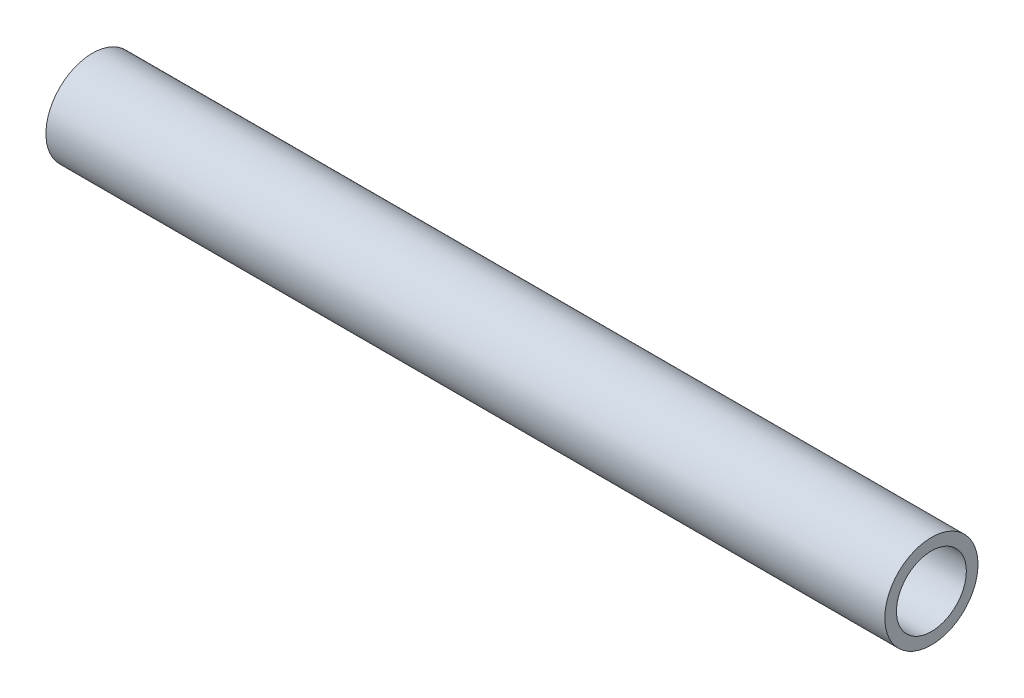
ISO-10303-21;
HEADER;
FILE_DESCRIPTION(('STEP AP214'),'2;1');
FILE_NAME('part.step','',(''),(''),'','','');
FILE_SCHEMA(('AUTOMOTIVE_DESIGN { 1 0 10303 214 1 1 1 1 }'));
ENDSEC;
DATA;
#1=APPLICATION_CONTEXT('core data for automotive mechanical design processes');
#2=APPLICATION_PROTOCOL_DEFINITION('international standard','automotive_design',2000,#1);
#3=PRODUCT_CONTEXT('',#1,'mechanical');
#4=PRODUCT('Part','Part','',(#3));
#5=PRODUCT_RELATED_PRODUCT_CATEGORY('part','',(#4));
#6=PRODUCT_DEFINITION_FORMATION('','',#4);
#7=PRODUCT_DEFINITION_CONTEXT('part definition',#1,'design');
#8=PRODUCT_DEFINITION('design','',#6,#7);
#9=PRODUCT_DEFINITION_SHAPE('','',#8);
#10=(LENGTH_UNIT() NAMED_UNIT(*) SI_UNIT(.MILLI.,.METRE.));
#11=(NAMED_UNIT(*) PLANE_ANGLE_UNIT() SI_UNIT($,.RADIAN.));
#12=(NAMED_UNIT(*) SI_UNIT($,.STERADIAN.) SOLID_ANGLE_UNIT());
#13=UNCERTAINTY_MEASURE_WITH_UNIT(LENGTH_MEASURE(1.E-05),#10,'distance_accuracy_value','');
#14=(GEOMETRIC_REPRESENTATION_CONTEXT(3) GLOBAL_UNCERTAINTY_ASSIGNED_CONTEXT((#13)) GLOBAL_UNIT_ASSIGNED_CONTEXT((#10,
#11,#12)) REPRESENTATION_CONTEXT('',''));
#15=CARTESIAN_POINT('',(0.,0.,0.));
#16=DIRECTION('',(0.,0.,1.));
#17=DIRECTION('',(1.,0.,0.));
#18=AXIS2_PLACEMENT_3D('',#15,#16,#17);
#19=CARTESIAN_POINT('',(36.,0.,0.));
#20=DIRECTION('',(1.,0.,0.));
#21=DIRECTION('',(0.,0.,-1.));
#22=AXIS2_PLACEMENT_3D('',#19,#20,#21);
#23=PLANE('',#22);
#24=CARTESIAN_POINT('',(36.,0.,0.));
#25=DIRECTION('',(1.,0.,0.));
#26=DIRECTION('',(0.,0.,-1.));
#27=AXIS2_PLACEMENT_3D('',#24,#25,#26);
#28=CIRCLE('',#27,2.);
#29=CARTESIAN_POINT('',(36.,0.,-2.));
#30=VERTEX_POINT('',#29);
#31=EDGE_CURVE('E10',#30,#30,#28,.T.);
#32=ORIENTED_EDGE('',*,*,#31,.T.);
#33=EDGE_LOOP('',(#32));
#34=FACE_BOUND('',#33,.T.);
#35=CARTESIAN_POINT('',(36.,0.,0.));
#36=DIRECTION('',(1.,0.,0.));
#37=DIRECTION('',(0.,0.,-1.));
#38=AXIS2_PLACEMENT_3D('',#35,#36,#37);
#39=CIRCLE('',#38,1.5);
#40=CARTESIAN_POINT('',(36.,0.,-1.5));
#41=VERTEX_POINT('',#40);
#42=EDGE_CURVE('E54',#41,#41,#39,.T.);
#43=ORIENTED_EDGE('',*,*,#42,.F.);
#44=EDGE_LOOP('',(#43));
#45=FACE_BOUND('',#44,.T.);
#46=ADVANCED_FACE('F41',(#34,#45),#23,.T.);
#47=CARTESIAN_POINT('',(0.,0.,0.));
#48=DIRECTION('',(1.,0.,0.));
#49=DIRECTION('',(0.,0.,-1.));
#50=AXIS2_PLACEMENT_3D('',#47,#48,#49);
#51=PLANE('',#50);
#52=CARTESIAN_POINT('',(0.,0.,0.));
#53=DIRECTION('',(1.,0.,0.));
#54=DIRECTION('',(0.,0.,-1.));
#55=AXIS2_PLACEMENT_3D('',#52,#53,#54);
#56=CIRCLE('',#55,2.);
#57=CARTESIAN_POINT('',(0.,0.,-2.));
#58=VERTEX_POINT('',#57);
#59=EDGE_CURVE('E45',#58,#58,#56,.T.);
#60=ORIENTED_EDGE('',*,*,#59,.F.);
#61=EDGE_LOOP('',(#60));
#62=FACE_BOUND('',#61,.T.);
#63=CARTESIAN_POINT('',(0.,0.,0.));
#64=DIRECTION('',(1.,0.,0.));
#65=DIRECTION('',(0.,0.,-1.));
#66=AXIS2_PLACEMENT_3D('',#63,#64,#65);
#67=CIRCLE('',#66,1.5);
#68=CARTESIAN_POINT('',(0.,0.,-1.5));
#69=VERTEX_POINT('',#68);
#70=EDGE_CURVE('E56',#69,#69,#67,.T.);
#71=ORIENTED_EDGE('',*,*,#70,.T.);
#72=EDGE_LOOP('',(#71));
#73=FACE_BOUND('',#72,.T.);
#74=ADVANCED_FACE('F68',(#62,#73),#51,.F.);
#75=CARTESIAN_POINT('',(36.,0.,0.));
#76=DIRECTION('',(-1.,0.,0.));
#77=DIRECTION('',(0.,0.,1.));
#78=AXIS2_PLACEMENT_3D('',#75,#76,#77);
#79=CYLINDRICAL_SURFACE('',#78,2.);
#80=ORIENTED_EDGE('',*,*,#31,.F.);
#81=EDGE_LOOP('',(#80));
#82=FACE_BOUND('',#81,.T.);
#83=ORIENTED_EDGE('',*,*,#59,.T.);
#84=EDGE_LOOP('',(#83));
#85=FACE_BOUND('',#84,.T.);
#86=ADVANCED_FACE('F43',(#82,#85),#79,.T.);
#87=CARTESIAN_POINT('',(36.,0.,0.));
#88=DIRECTION('',(-1.,0.,0.));
#89=DIRECTION('',(0.,0.,1.));
#90=AXIS2_PLACEMENT_3D('',#87,#88,#89);
#91=CYLINDRICAL_SURFACE('',#90,1.5);
#92=ORIENTED_EDGE('',*,*,#42,.T.);
#93=EDGE_LOOP('',(#92));
#94=FACE_BOUND('',#93,.T.);
#95=ORIENTED_EDGE('',*,*,#70,.F.);
#96=EDGE_LOOP('',(#95));
#97=FACE_BOUND('',#96,.T.);
#98=ADVANCED_FACE('F64',(#94,#97),#91,.F.);
#99=CLOSED_SHELL('',(#46,#74,#86,#98));
#100=MANIFOLD_SOLID_BREP('B2',#99);
#101=ADVANCED_BREP_SHAPE_REPRESENTATION('',(#18,#100),#14);
#102=SHAPE_DEFINITION_REPRESENTATION(#9,#101);
ENDSEC;
END-ISO-10303-21;
